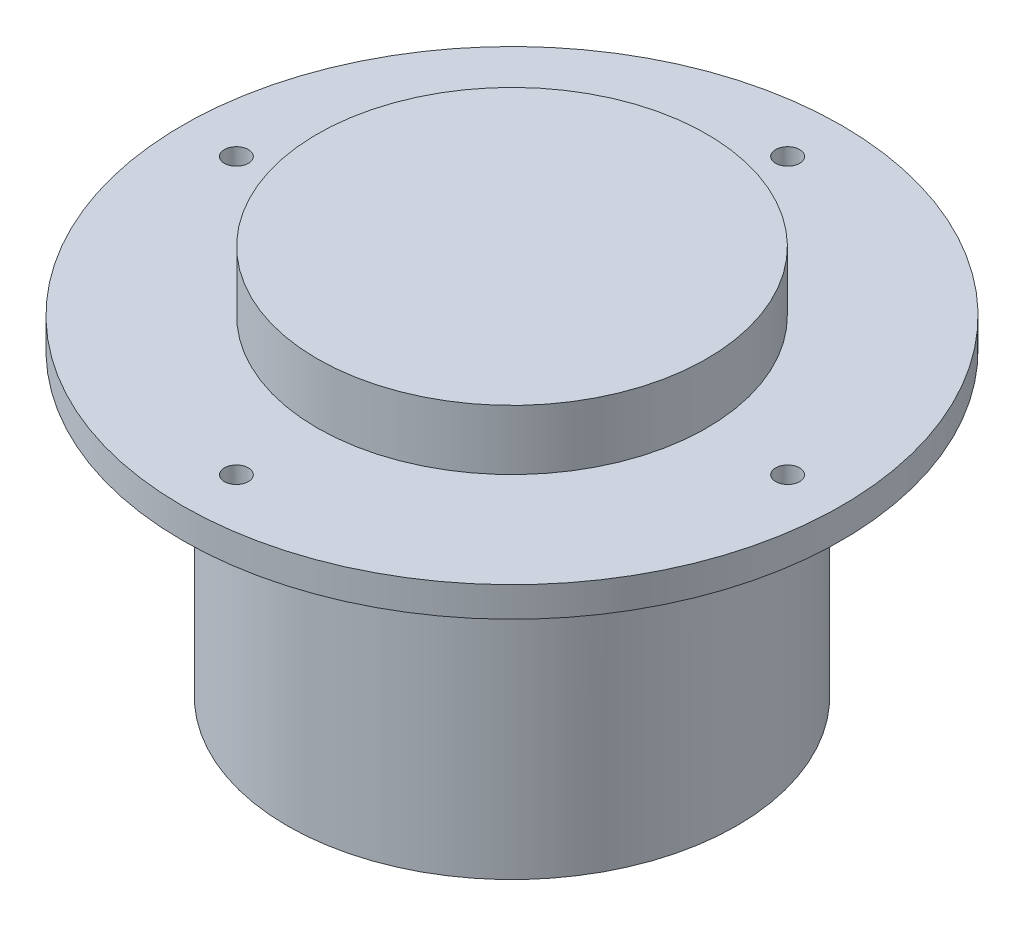
ISO-10303-21;
HEADER;
FILE_DESCRIPTION(('STEP AP214'),'2;1');
FILE_NAME('part.step','',(''),(''),'','','');
FILE_SCHEMA(('AUTOMOTIVE_DESIGN { 1 0 10303 214 1 1 1 1 }'));
ENDSEC;
DATA;
#1=APPLICATION_CONTEXT('core data for automotive mechanical design processes');
#2=APPLICATION_PROTOCOL_DEFINITION('international standard','automotive_design',2000,#1);
#3=PRODUCT_CONTEXT('',#1,'mechanical');
#4=PRODUCT('Part','Part','',(#3));
#5=PRODUCT_RELATED_PRODUCT_CATEGORY('part','',(#4));
#6=PRODUCT_DEFINITION_FORMATION('','',#4);
#7=PRODUCT_DEFINITION_CONTEXT('part definition',#1,'design');
#8=PRODUCT_DEFINITION('design','',#6,#7);
#9=PRODUCT_DEFINITION_SHAPE('','',#8);
#10=(LENGTH_UNIT() NAMED_UNIT(*) SI_UNIT(.MILLI.,.METRE.));
#11=(NAMED_UNIT(*) PLANE_ANGLE_UNIT() SI_UNIT($,.RADIAN.));
#12=(NAMED_UNIT(*) SI_UNIT($,.STERADIAN.) SOLID_ANGLE_UNIT());
#13=UNCERTAINTY_MEASURE_WITH_UNIT(LENGTH_MEASURE(1.E-05),#10,'distance_accuracy_value','');
#14=(GEOMETRIC_REPRESENTATION_CONTEXT(3) GLOBAL_UNCERTAINTY_ASSIGNED_CONTEXT((#13)) GLOBAL_UNIT_ASSIGNED_CONTEXT((#10,
#11,#12)) REPRESENTATION_CONTEXT('',''));
#15=CARTESIAN_POINT('',(0.,0.,0.));
#16=DIRECTION('',(0.,0.,1.));
#17=DIRECTION('',(1.,0.,0.));
#18=AXIS2_PLACEMENT_3D('',#15,#16,#17);
#19=CARTESIAN_POINT('',(46.,5.,-4.81824424760352E-13));
#20=DIRECTION('',(0.,-1.,0.));
#21=DIRECTION('',(1.,0.,0.));
#22=AXIS2_PLACEMENT_3D('',#19,#20,#21);
#23=CYLINDRICAL_SURFACE('',#22,2.);
#24=CARTESIAN_POINT('',(46.,5.,-4.81824424760352E-13));
#25=DIRECTION('',(0.,1.,0.));
#26=DIRECTION('',(-1.,0.,0.));
#27=AXIS2_PLACEMENT_3D('',#24,#25,#26);
#28=CIRCLE('',#27,2.);
#29=CARTESIAN_POINT('',(44.,5.,-4.60875536727294E-13));
#30=VERTEX_POINT('',#29);
#31=EDGE_CURVE('E47',#30,#30,#28,.T.);
#32=ORIENTED_EDGE('',*,*,#31,.T.);
#33=EDGE_LOOP('',(#32));
#34=FACE_BOUND('',#33,.T.);
#35=CARTESIAN_POINT('',(46.,0.,-4.81824424760352E-13));
#36=DIRECTION('',(0.,1.,0.));
#37=DIRECTION('',(-1.,0.,0.));
#38=AXIS2_PLACEMENT_3D('',#35,#36,#37);
#39=CIRCLE('',#38,2.);
#40=CARTESIAN_POINT('',(44.,0.,-4.60875536727294E-13));
#41=VERTEX_POINT('',#40);
#42=EDGE_CURVE('E11',#41,#41,#39,.T.);
#43=ORIENTED_EDGE('',*,*,#42,.F.);
#44=EDGE_LOOP('',(#43));
#45=FACE_BOUND('',#44,.T.);
#46=ADVANCED_FACE('F41',(#34,#45),#23,.F.);
#47=CARTESIAN_POINT('',(0.,5.,46.));
#48=DIRECTION('',(0.,-1.,0.));
#49=DIRECTION('',(0.,0.,1.));
#50=AXIS2_PLACEMENT_3D('',#47,#48,#49);
#51=CYLINDRICAL_SURFACE('',#50,2.);
#52=CARTESIAN_POINT('',(0.,5.,46.));
#53=DIRECTION('',(0.,1.,0.));
#54=DIRECTION('',(0.,0.,-1.));
#55=AXIS2_PLACEMENT_3D('',#52,#53,#54);
#56=CIRCLE('',#55,2.);
#57=CARTESIAN_POINT('',(0.,5.,44.));
#58=VERTEX_POINT('',#57);
#59=EDGE_CURVE('E55',#58,#58,#56,.T.);
#60=ORIENTED_EDGE('',*,*,#59,.T.);
#61=EDGE_LOOP('',(#60));
#62=FACE_BOUND('',#61,.T.);
#63=CARTESIAN_POINT('',(0.,0.,46.));
#64=DIRECTION('',(0.,1.,0.));
#65=DIRECTION('',(0.,0.,-1.));
#66=AXIS2_PLACEMENT_3D('',#63,#64,#65);
#67=CIRCLE('',#66,2.);
#68=CARTESIAN_POINT('',(0.,0.,44.));
#69=VERTEX_POINT('',#68);
#70=EDGE_CURVE('E51',#69,#69,#67,.T.);
#71=ORIENTED_EDGE('',*,*,#70,.F.);
#72=EDGE_LOOP('',(#71));
#73=FACE_BOUND('',#72,.T.);
#74=ADVANCED_FACE('F116',(#62,#73),#51,.F.);
#75=CARTESIAN_POINT('',(-46.,5.,1.60608141586784E-13));
#76=DIRECTION('',(0.,-1.,0.));
#77=DIRECTION('',(-1.,0.,0.));
#78=AXIS2_PLACEMENT_3D('',#75,#76,#77);
#79=CYLINDRICAL_SURFACE('',#78,2.);
#80=CARTESIAN_POINT('',(-46.,5.,1.60608141586784E-13));
#81=DIRECTION('',(0.,1.,0.));
#82=DIRECTION('',(1.,0.,0.));
#83=AXIS2_PLACEMENT_3D('',#80,#81,#82);
#84=CIRCLE('',#83,2.);
#85=CARTESIAN_POINT('',(-44.,5.,1.53625178909098E-13));
#86=VERTEX_POINT('',#85);
#87=EDGE_CURVE('E63',#86,#86,#84,.T.);
#88=ORIENTED_EDGE('',*,*,#87,.T.);
#89=EDGE_LOOP('',(#88));
#90=FACE_BOUND('',#89,.T.);
#91=CARTESIAN_POINT('',(-46.,0.,1.60608141586784E-13));
#92=DIRECTION('',(0.,1.,0.));
#93=DIRECTION('',(1.,0.,0.));
#94=AXIS2_PLACEMENT_3D('',#91,#92,#93);
#95=CIRCLE('',#94,2.);
#96=CARTESIAN_POINT('',(-44.,0.,1.53625178909098E-13));
#97=VERTEX_POINT('',#96);
#98=EDGE_CURVE('E60',#97,#97,#95,.T.);
#99=ORIENTED_EDGE('',*,*,#98,.F.);
#100=EDGE_LOOP('',(#99));
#101=FACE_BOUND('',#100,.T.);
#102=ADVANCED_FACE('F121',(#90,#101),#79,.F.);
#103=CARTESIAN_POINT('',(0.,5.,-46.));
#104=DIRECTION('',(0.,-1.,0.));
#105=DIRECTION('',(0.,0.,-1.));
#106=AXIS2_PLACEMENT_3D('',#103,#104,#105);
#107=CYLINDRICAL_SURFACE('',#106,2.);
#108=CARTESIAN_POINT('',(0.,5.,-46.));
#109=DIRECTION('',(0.,1.,0.));
#110=DIRECTION('',(0.,0.,1.));
#111=AXIS2_PLACEMENT_3D('',#108,#109,#110);
#112=CIRCLE('',#111,2.);
#113=CARTESIAN_POINT('',(0.,5.,-44.));
#114=VERTEX_POINT('',#113);
#115=EDGE_CURVE('E78',#114,#114,#112,.T.);
#116=ORIENTED_EDGE('',*,*,#115,.T.);
#117=EDGE_LOOP('',(#116));
#118=FACE_BOUND('',#117,.T.);
#119=CARTESIAN_POINT('',(0.,0.,-46.));
#120=DIRECTION('',(0.,1.,0.));
#121=DIRECTION('',(0.,0.,1.));
#122=AXIS2_PLACEMENT_3D('',#119,#120,#121);
#123=CIRCLE('',#122,2.);
#124=CARTESIAN_POINT('',(0.,0.,-44.));
#125=VERTEX_POINT('',#124);
#126=EDGE_CURVE('E79',#125,#125,#123,.T.);
#127=ORIENTED_EDGE('',*,*,#126,.F.);
#128=EDGE_LOOP('',(#127));
#129=FACE_BOUND('',#128,.T.);
#130=ADVANCED_FACE('F127',(#118,#129),#107,.F.);
#131=CARTESIAN_POINT('',(0.,5.,0.));
#132=DIRECTION('',(0.,-1.,0.));
#133=DIRECTION('',(0.,0.,-1.));
#134=AXIS2_PLACEMENT_3D('',#131,#132,#133);
#135=CYLINDRICAL_SURFACE('',#134,55.);
#136=CARTESIAN_POINT('',(0.,5.,0.));
#137=DIRECTION('',(0.,1.,0.));
#138=DIRECTION('',(0.,0.,1.));
#139=AXIS2_PLACEMENT_3D('',#136,#137,#138);
#140=CIRCLE('',#139,55.);
#141=CARTESIAN_POINT('',(0.,5.,55.));
#142=VERTEX_POINT('',#141);
#143=EDGE_CURVE('E74',#142,#142,#140,.T.);
#144=ORIENTED_EDGE('',*,*,#143,.F.);
#145=EDGE_LOOP('',(#144));
#146=FACE_BOUND('',#145,.T.);
#147=CARTESIAN_POINT('',(0.,0.,0.));
#148=DIRECTION('',(0.,1.,0.));
#149=DIRECTION('',(0.,0.,1.));
#150=AXIS2_PLACEMENT_3D('',#147,#148,#149);
#151=CIRCLE('',#150,55.);
#152=CARTESIAN_POINT('',(0.,0.,55.));
#153=VERTEX_POINT('',#152);
#154=EDGE_CURVE('E75',#153,#153,#151,.T.);
#155=ORIENTED_EDGE('',*,*,#154,.T.);
#156=EDGE_LOOP('',(#155));
#157=FACE_BOUND('',#156,.T.);
#158=ADVANCED_FACE('F134',(#146,#157),#135,.T.);
#159=CARTESIAN_POINT('',(0.,5.,0.));
#160=DIRECTION('',(0.,1.,0.));
#161=DIRECTION('',(0.,0.,1.));
#162=AXIS2_PLACEMENT_3D('',#159,#160,#161);
#163=PLANE('',#162);
#164=ORIENTED_EDGE('',*,*,#31,.F.);
#165=EDGE_LOOP('',(#164));
#166=FACE_BOUND('',#165,.T.);
#167=ORIENTED_EDGE('',*,*,#59,.F.);
#168=EDGE_LOOP('',(#167));
#169=FACE_BOUND('',#168,.T.);
#170=ORIENTED_EDGE('',*,*,#87,.F.);
#171=EDGE_LOOP('',(#170));
#172=FACE_BOUND('',#171,.T.);
#173=CARTESIAN_POINT('',(0.,5.,0.));
#174=DIRECTION('',(0.,1.,0.));
#175=DIRECTION('',(0.,0.,1.));
#176=AXIS2_PLACEMENT_3D('',#173,#174,#175);
#177=CIRCLE('',#176,32.5);
#178=CARTESIAN_POINT('',(0.,5.,32.5));
#179=VERTEX_POINT('',#178);
#180=EDGE_CURVE('E67',#179,#179,#177,.F.);
#181=ORIENTED_EDGE('',*,*,#180,.T.);
#182=EDGE_LOOP('',(#181));
#183=FACE_BOUND('',#182,.T.);
#184=ORIENTED_EDGE('',*,*,#115,.F.);
#185=EDGE_LOOP('',(#184));
#186=FACE_BOUND('',#185,.T.);
#187=ORIENTED_EDGE('',*,*,#143,.T.);
#188=EDGE_LOOP('',(#187));
#189=FACE_BOUND('',#188,.T.);
#190=ADVANCED_FACE('F137',(#166,#169,#172,#183,#186,#189),#163,.T.);
#191=CARTESIAN_POINT('',(0.,0.,0.));
#192=DIRECTION('',(0.,1.,0.));
#193=DIRECTION('',(0.,0.,1.));
#194=AXIS2_PLACEMENT_3D('',#191,#192,#193);
#195=PLANE('',#194);
#196=ORIENTED_EDGE('',*,*,#42,.T.);
#197=EDGE_LOOP('',(#196));
#198=FACE_BOUND('',#197,.T.);
#199=ORIENTED_EDGE('',*,*,#70,.T.);
#200=EDGE_LOOP('',(#199));
#201=FACE_BOUND('',#200,.T.);
#202=ORIENTED_EDGE('',*,*,#98,.T.);
#203=EDGE_LOOP('',(#202));
#204=FACE_BOUND('',#203,.T.);
#205=CARTESIAN_POINT('',(0.,0.,0.));
#206=DIRECTION('',(0.,1.,0.));
#207=DIRECTION('',(0.,0.,1.));
#208=AXIS2_PLACEMENT_3D('',#205,#206,#207);
#209=CIRCLE('',#208,37.5);
#210=CARTESIAN_POINT('',(0.,0.,37.5));
#211=VERTEX_POINT('',#210);
#212=EDGE_CURVE('E66',#211,#211,#209,.F.);
#213=ORIENTED_EDGE('',*,*,#212,.F.);
#214=EDGE_LOOP('',(#213));
#215=FACE_BOUND('',#214,.T.);
#216=ORIENTED_EDGE('',*,*,#126,.T.);
#217=EDGE_LOOP('',(#216));
#218=FACE_BOUND('',#217,.T.);
#219=ORIENTED_EDGE('',*,*,#154,.F.);
#220=EDGE_LOOP('',(#219));
#221=FACE_BOUND('',#220,.T.);
#222=ADVANCED_FACE('F112',(#198,#201,#204,#215,#218,#221),#195,.F.);
#223=CARTESIAN_POINT('',(0.,-50.,0.));
#224=DIRECTION('',(0.,-1.,0.));
#225=DIRECTION('',(0.,0.,-1.));
#226=AXIS2_PLACEMENT_3D('',#223,#224,#225);
#227=PLANE('',#226);
#228=CARTESIAN_POINT('',(0.,-50.,0.));
#229=DIRECTION('',(0.,-1.,0.));
#230=DIRECTION('',(0.,0.,-1.));
#231=AXIS2_PLACEMENT_3D('',#228,#229,#230);
#232=CIRCLE('',#231,37.5);
#233=CARTESIAN_POINT('',(0.,-50.,-37.5));
#234=VERTEX_POINT('',#233);
#235=EDGE_CURVE('E82',#234,#234,#232,.T.);
#236=ORIENTED_EDGE('',*,*,#235,.T.);
#237=EDGE_LOOP('',(#236));
#238=FACE_BOUND('',#237,.T.);
#239=CARTESIAN_POINT('',(0.,-50.,0.));
#240=DIRECTION('',(0.,-1.,0.));
#241=DIRECTION('',(0.,0.,-1.));
#242=AXIS2_PLACEMENT_3D('',#239,#240,#241);
#243=CIRCLE('',#242,32.5);
#244=CARTESIAN_POINT('',(0.,-50.,-32.5));
#245=VERTEX_POINT('',#244);
#246=EDGE_CURVE('E89',#245,#245,#243,.T.);
#247=ORIENTED_EDGE('',*,*,#246,.F.);
#248=EDGE_LOOP('',(#247));
#249=FACE_BOUND('',#248,.T.);
#250=ADVANCED_FACE('F141',(#238,#249),#227,.T.);
#251=CARTESIAN_POINT('',(0.,-50.,0.));
#252=DIRECTION('',(0.,1.,0.));
#253=DIRECTION('',(0.,0.,1.));
#254=AXIS2_PLACEMENT_3D('',#251,#252,#253);
#255=CYLINDRICAL_SURFACE('',#254,37.5);
#256=ORIENTED_EDGE('',*,*,#235,.F.);
#257=EDGE_LOOP('',(#256));
#258=FACE_BOUND('',#257,.T.);
#259=ORIENTED_EDGE('',*,*,#212,.T.);
#260=EDGE_LOOP('',(#259));
#261=FACE_BOUND('',#260,.T.);
#262=ADVANCED_FACE('F145',(#258,#261),#255,.T.);
#263=CARTESIAN_POINT('',(0.,-50.,0.));
#264=DIRECTION('',(0.,1.,0.));
#265=DIRECTION('',(0.,0.,1.));
#266=AXIS2_PLACEMENT_3D('',#263,#264,#265);
#267=CYLINDRICAL_SURFACE('',#266,32.5);
#268=ORIENTED_EDGE('',*,*,#246,.T.);
#269=EDGE_LOOP('',(#268));
#270=FACE_BOUND('',#269,.T.);
#271=CARTESIAN_POINT('',(0.,0.,0.));
#272=DIRECTION('',(0.,-1.,0.));
#273=DIRECTION('',(0.,0.,-1.));
#274=AXIS2_PLACEMENT_3D('',#271,#272,#273);
#275=CIRCLE('',#274,32.5);
#276=CARTESIAN_POINT('',(0.,0.,-32.5));
#277=VERTEX_POINT('',#276);
#278=EDGE_CURVE('E70',#277,#277,#275,.T.);
#279=ORIENTED_EDGE('',*,*,#278,.F.);
#280=EDGE_LOOP('',(#279));
#281=FACE_BOUND('',#280,.T.);
#282=ADVANCED_FACE('F109',(#270,#281),#267,.F.);
#283=ORIENTED_EDGE('',*,*,#278,.T.);
#284=EDGE_LOOP('',(#283));
#285=FACE_BOUND('',#284,.T.);
#286=ADVANCED_FACE('F101',(#285),#195,.F.);
#287=CARTESIAN_POINT('',(0.,15.,0.));
#288=DIRECTION('',(0.,-1.,0.));
#289=DIRECTION('',(0.,0.,-1.));
#290=AXIS2_PLACEMENT_3D('',#287,#288,#289);
#291=CYLINDRICAL_SURFACE('',#290,32.5);
#292=ORIENTED_EDGE('',*,*,#180,.F.);
#293=EDGE_LOOP('',(#292));
#294=FACE_BOUND('',#293,.T.);
#295=CARTESIAN_POINT('',(0.,15.,0.));
#296=DIRECTION('',(0.,1.,0.));
#297=DIRECTION('',(0.,0.,1.));
#298=AXIS2_PLACEMENT_3D('',#295,#296,#297);
#299=CIRCLE('',#298,32.5);
#300=CARTESIAN_POINT('',(0.,15.,32.5));
#301=VERTEX_POINT('',#300);
#302=EDGE_CURVE('E71',#301,#301,#299,.T.);
#303=ORIENTED_EDGE('',*,*,#302,.F.);
#304=EDGE_LOOP('',(#303));
#305=FACE_BOUND('',#304,.T.);
#306=ADVANCED_FACE('F99',(#294,#305),#291,.T.);
#307=CARTESIAN_POINT('',(0.,15.,0.));
#308=DIRECTION('',(0.,1.,0.));
#309=DIRECTION('',(0.,0.,1.));
#310=AXIS2_PLACEMENT_3D('',#307,#308,#309);
#311=PLANE('',#310);
#312=ORIENTED_EDGE('',*,*,#302,.T.);
#313=EDGE_LOOP('',(#312));
#314=FACE_BOUND('',#313,.T.);
#315=ADVANCED_FACE('F97',(#314),#311,.T.);
#316=CLOSED_SHELL('',(#46,#74,#102,#130,#158,#190,#222,#250,#262,#282,#286,#306,#315));
#317=MANIFOLD_SOLID_BREP('B2',#316);
#318=ADVANCED_BREP_SHAPE_REPRESENTATION('',(#18,#317),#14);
#319=SHAPE_DEFINITION_REPRESENTATION(#9,#318);
ENDSEC;
END-ISO-10303-21;
